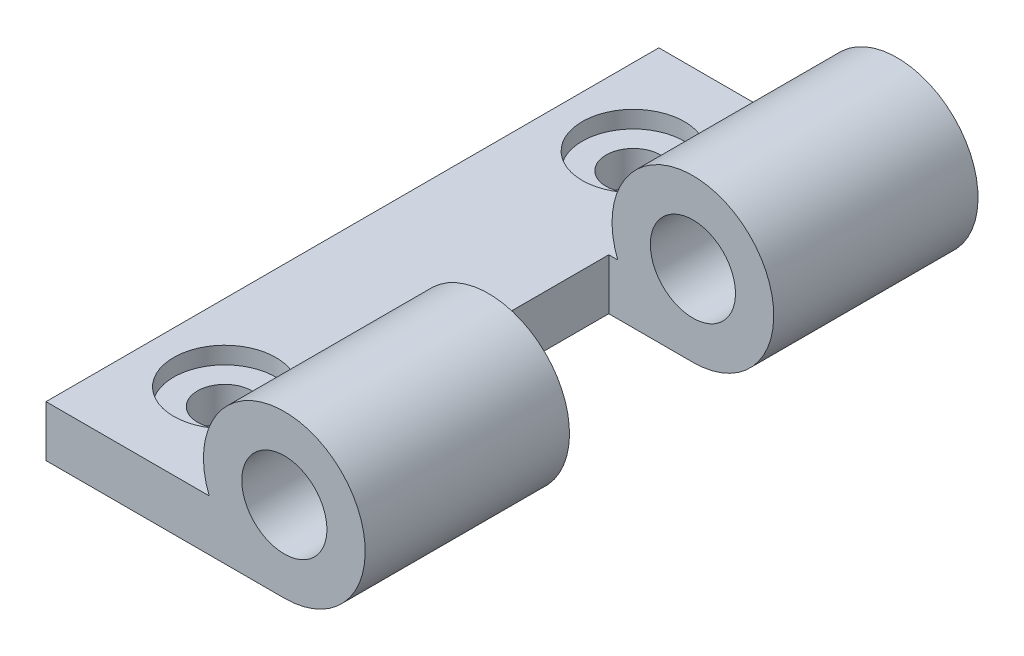
ISO-10303-21;
HEADER;
FILE_DESCRIPTION(('STEP AP214'),'2;1');
FILE_NAME('part.step','',(''),(''),'','','');
FILE_SCHEMA(('AUTOMOTIVE_DESIGN { 1 0 10303 214 1 1 1 1 }'));
ENDSEC;
DATA;
#1=APPLICATION_CONTEXT('core data for automotive mechanical design processes');
#2=APPLICATION_PROTOCOL_DEFINITION('international standard','automotive_design',2000,#1);
#3=PRODUCT_CONTEXT('',#1,'mechanical');
#4=PRODUCT('Part','Part','',(#3));
#5=PRODUCT_RELATED_PRODUCT_CATEGORY('part','',(#4));
#6=PRODUCT_DEFINITION_FORMATION('','',#4);
#7=PRODUCT_DEFINITION_CONTEXT('part definition',#1,'design');
#8=PRODUCT_DEFINITION('design','',#6,#7);
#9=PRODUCT_DEFINITION_SHAPE('','',#8);
#10=(LENGTH_UNIT() NAMED_UNIT(*) SI_UNIT(.MILLI.,.METRE.));
#11=(NAMED_UNIT(*) PLANE_ANGLE_UNIT() SI_UNIT($,.RADIAN.));
#12=(NAMED_UNIT(*) SI_UNIT($,.STERADIAN.) SOLID_ANGLE_UNIT());
#13=UNCERTAINTY_MEASURE_WITH_UNIT(LENGTH_MEASURE(1.E-05),#10,'distance_accuracy_value','');
#14=(GEOMETRIC_REPRESENTATION_CONTEXT(3) GLOBAL_UNCERTAINTY_ASSIGNED_CONTEXT((#13)) GLOBAL_UNIT_ASSIGNED_CONTEXT((#10,
#11,#12)) REPRESENTATION_CONTEXT('',''));
#15=CARTESIAN_POINT('',(0.,0.,0.));
#16=DIRECTION('',(0.,0.,1.));
#17=DIRECTION('',(1.,0.,0.));
#18=AXIS2_PLACEMENT_3D('',#15,#16,#17);
#19=CARTESIAN_POINT('',(4.5,-7.00000000000003,30.));
#20=DIRECTION('',(0.,1.,0.));
#21=DIRECTION('',(0.,0.,1.));
#22=AXIS2_PLACEMENT_3D('',#19,#20,#21);
#23=CYLINDRICAL_SURFACE('',#22,1.6);
#24=CARTESIAN_POINT('',(4.5,0.,30.));
#25=DIRECTION('',(0.,1.,0.));
#26=DIRECTION('',(0.,0.,1.));
#27=AXIS2_PLACEMENT_3D('',#24,#25,#26);
#28=CIRCLE('',#27,1.6);
#29=CARTESIAN_POINT('',(4.5,0.,31.6));
#30=VERTEX_POINT('',#29);
#31=EDGE_CURVE('E188',#30,#30,#28,.T.);
#32=ORIENTED_EDGE('',*,*,#31,.F.);
#33=EDGE_LOOP('',(#32));
#34=FACE_BOUND('',#33,.T.);
#35=CARTESIAN_POINT('',(4.5,2.,30.));
#36=DIRECTION('',(0.,1.,0.));
#37=DIRECTION('',(0.,0.,1.));
#38=AXIS2_PLACEMENT_3D('',#35,#36,#37);
#39=CIRCLE('',#38,1.6);
#40=CARTESIAN_POINT('',(4.5,2.,31.6));
#41=VERTEX_POINT('',#40);
#42=EDGE_CURVE('E50',#41,#41,#39,.F.);
#43=ORIENTED_EDGE('',*,*,#42,.F.);
#44=EDGE_LOOP('',(#43));
#45=FACE_BOUND('',#44,.T.);
#46=ADVANCED_FACE('F46',(#34,#45),#23,.F.);
#47=CARTESIAN_POINT('',(4.5,-7.00000000000003,6.));
#48=DIRECTION('',(0.,1.,0.));
#49=DIRECTION('',(0.,0.,1.));
#50=AXIS2_PLACEMENT_3D('',#47,#48,#49);
#51=CYLINDRICAL_SURFACE('',#50,1.6);
#52=CARTESIAN_POINT('',(4.5,0.,6.));
#53=DIRECTION('',(0.,1.,0.));
#54=DIRECTION('',(0.,0.,1.));
#55=AXIS2_PLACEMENT_3D('',#52,#53,#54);
#56=CIRCLE('',#55,1.6);
#57=CARTESIAN_POINT('',(4.5,0.,7.6));
#58=VERTEX_POINT('',#57);
#59=EDGE_CURVE('E191',#58,#58,#56,.T.);
#60=ORIENTED_EDGE('',*,*,#59,.F.);
#61=EDGE_LOOP('',(#60));
#62=FACE_BOUND('',#61,.T.);
#63=CARTESIAN_POINT('',(4.5,2.,6.));
#64=DIRECTION('',(0.,1.,0.));
#65=DIRECTION('',(0.,0.,1.));
#66=AXIS2_PLACEMENT_3D('',#63,#64,#65);
#67=CIRCLE('',#66,1.6);
#68=CARTESIAN_POINT('',(4.5,2.,7.6));
#69=VERTEX_POINT('',#68);
#70=EDGE_CURVE('E193',#69,#69,#67,.F.);
#71=ORIENTED_EDGE('',*,*,#70,.F.);
#72=EDGE_LOOP('',(#71));
#73=FACE_BOUND('',#72,.T.);
#74=ADVANCED_FACE('F245',(#62,#73),#51,.F.);
#75=CARTESIAN_POINT('',(14.,4.75,51.));
#76=DIRECTION('',(0.,0.,-1.));
#77=DIRECTION('',(-1.,0.,0.));
#78=AXIS2_PLACEMENT_3D('',#75,#76,#77);
#79=CYLINDRICAL_SURFACE('',#78,2.5);
#80=CARTESIAN_POINT('',(14.,4.75,36.));
#81=DIRECTION('',(0.,0.,-1.));
#82=DIRECTION('',(-1.,0.,0.));
#83=AXIS2_PLACEMENT_3D('',#80,#81,#82);
#84=CIRCLE('',#83,2.5);
#85=CARTESIAN_POINT('',(11.5,4.75,36.));
#86=VERTEX_POINT('',#85);
#87=EDGE_CURVE('E149',#86,#86,#84,.T.);
#88=ORIENTED_EDGE('',*,*,#87,.F.);
#89=EDGE_LOOP('',(#88));
#90=FACE_BOUND('',#89,.T.);
#91=CARTESIAN_POINT('',(14.,4.75,24.));
#92=DIRECTION('',(0.,0.,1.));
#93=DIRECTION('',(1.,0.,0.));
#94=AXIS2_PLACEMENT_3D('',#91,#92,#93);
#95=CIRCLE('',#94,2.5);
#96=CARTESIAN_POINT('',(16.5,4.75,24.));
#97=VERTEX_POINT('',#96);
#98=EDGE_CURVE('E55',#97,#97,#95,.T.);
#99=ORIENTED_EDGE('',*,*,#98,.F.);
#100=EDGE_LOOP('',(#99));
#101=FACE_BOUND('',#100,.T.);
#102=ADVANCED_FACE('F251',(#90,#101),#79,.F.);
#103=CARTESIAN_POINT('',(0.,3.,0.));
#104=DIRECTION('',(1.,0.,0.));
#105=DIRECTION('',(0.,0.,-1.));
#106=AXIS2_PLACEMENT_3D('',#103,#104,#105);
#107=PLANE('',#106);
#108=DIRECTION('',(0.,0.,1.));
#109=VECTOR('',#108,1.);
#110=CARTESIAN_POINT('',(0.,0.,0.));
#111=LINE('',#110,#109);
#112=CARTESIAN_POINT('',(0.,0.,0.));
#113=VERTEX_POINT('',#112);
#114=CARTESIAN_POINT('',(0.,0.,36.));
#115=VERTEX_POINT('',#114);
#116=EDGE_CURVE('E165',#113,#115,#111,.T.);
#117=ORIENTED_EDGE('',*,*,#116,.T.);
#118=DIRECTION('',(0.,-1.,0.));
#119=VECTOR('',#118,1.);
#120=CARTESIAN_POINT('',(0.,3.,36.));
#121=LINE('',#120,#119);
#122=CARTESIAN_POINT('',(0.,3.,36.));
#123=VERTEX_POINT('',#122);
#124=EDGE_CURVE('E183',#123,#115,#121,.T.);
#125=ORIENTED_EDGE('',*,*,#124,.F.);
#126=DIRECTION('',(0.,0.,1.));
#127=VECTOR('',#126,1.);
#128=CARTESIAN_POINT('',(0.,3.,0.));
#129=LINE('',#128,#127);
#130=CARTESIAN_POINT('',(0.,3.,0.));
#131=VERTEX_POINT('',#130);
#132=EDGE_CURVE('E166',#131,#123,#129,.T.);
#133=ORIENTED_EDGE('',*,*,#132,.F.);
#134=DIRECTION('',(0.,-1.,0.));
#135=VECTOR('',#134,1.);
#136=CARTESIAN_POINT('',(0.,3.,0.));
#137=LINE('',#136,#135);
#138=EDGE_CURVE('E172',#131,#113,#137,.T.);
#139=ORIENTED_EDGE('',*,*,#138,.T.);
#140=EDGE_LOOP('',(#117,#125,#133,#139));
#141=FACE_BOUND('',#140,.T.);
#142=ADVANCED_FACE('F48',(#141),#107,.F.);
#143=CARTESIAN_POINT('',(0.,3.,36.));
#144=DIRECTION('',(0.,0.,-1.));
#145=DIRECTION('',(-1.,0.,0.));
#146=AXIS2_PLACEMENT_3D('',#143,#144,#145);
#147=PLANE('',#146);
#148=ORIENTED_EDGE('',*,*,#87,.T.);
#149=EDGE_LOOP('',(#148));
#150=FACE_BOUND('',#149,.T.);
#151=DIRECTION('',(1.,0.,0.));
#152=VECTOR('',#151,1.);
#153=CARTESIAN_POINT('',(0.,0.,36.));
#154=LINE('',#153,#152);
#155=CARTESIAN_POINT('',(14.,0.,36.));
#156=VERTEX_POINT('',#155);
#157=EDGE_CURVE('E175',#115,#156,#154,.T.);
#158=ORIENTED_EDGE('',*,*,#157,.T.);
#159=CARTESIAN_POINT('',(14.,4.75,36.));
#160=DIRECTION('',(0.,0.,1.));
#161=DIRECTION('',(1.,0.,0.));
#162=AXIS2_PLACEMENT_3D('',#159,#160,#161);
#163=CIRCLE('',#162,4.75);
#164=CARTESIAN_POINT('',(9.58411956683608,3.,36.));
#165=VERTEX_POINT('',#164);
#166=EDGE_CURVE('E152',#156,#165,#163,.T.);
#167=ORIENTED_EDGE('',*,*,#166,.T.);
#168=DIRECTION('',(1.,0.,0.));
#169=VECTOR('',#168,1.);
#170=CARTESIAN_POINT('',(0.,3.,36.));
#171=LINE('',#170,#169);
#172=EDGE_CURVE('E63',#123,#165,#171,.T.);
#173=ORIENTED_EDGE('',*,*,#172,.F.);
#174=ORIENTED_EDGE('',*,*,#124,.T.);
#175=EDGE_LOOP('',(#158,#167,#173,#174));
#176=FACE_BOUND('',#175,.T.);
#177=ADVANCED_FACE('F222',(#150,#176),#147,.F.);
#178=CARTESIAN_POINT('',(0.,3.,0.));
#179=DIRECTION('',(0.,0.,1.));
#180=DIRECTION('',(1.,0.,0.));
#181=AXIS2_PLACEMENT_3D('',#178,#179,#180);
#182=PLANE('',#181);
#183=CARTESIAN_POINT('',(14.,4.75,0.));
#184=DIRECTION('',(0.,0.,-1.));
#185=DIRECTION('',(-1.,0.,0.));
#186=AXIS2_PLACEMENT_3D('',#183,#184,#185);
#187=CIRCLE('',#186,2.5);
#188=CARTESIAN_POINT('',(11.5,4.75,0.));
#189=VERTEX_POINT('',#188);
#190=EDGE_CURVE('E143',#189,#189,#187,.T.);
#191=ORIENTED_EDGE('',*,*,#190,.F.);
#192=EDGE_LOOP('',(#191));
#193=FACE_BOUND('',#192,.T.);
#194=CARTESIAN_POINT('',(14.,4.75,0.));
#195=DIRECTION('',(0.,0.,-1.));
#196=DIRECTION('',(-1.,0.,0.));
#197=AXIS2_PLACEMENT_3D('',#194,#195,#196);
#198=CIRCLE('',#197,4.75);
#199=CARTESIAN_POINT('',(9.58411956683608,3.,0.));
#200=VERTEX_POINT('',#199);
#201=CARTESIAN_POINT('',(14.,0.,0.));
#202=VERTEX_POINT('',#201);
#203=EDGE_CURVE('E159',#200,#202,#198,.T.);
#204=ORIENTED_EDGE('',*,*,#203,.T.);
#205=DIRECTION('',(-1.,0.,0.));
#206=VECTOR('',#205,1.);
#207=CARTESIAN_POINT('',(0.,0.,0.));
#208=LINE('',#207,#206);
#209=EDGE_CURVE('E168',#202,#113,#208,.T.);
#210=ORIENTED_EDGE('',*,*,#209,.T.);
#211=ORIENTED_EDGE('',*,*,#138,.F.);
#212=DIRECTION('',(-1.,0.,0.));
#213=VECTOR('',#212,1.);
#214=CARTESIAN_POINT('',(0.,3.,0.));
#215=LINE('',#214,#213);
#216=EDGE_CURVE('E170',#200,#131,#215,.T.);
#217=ORIENTED_EDGE('',*,*,#216,.F.);
#218=EDGE_LOOP('',(#204,#210,#211,#217));
#219=FACE_BOUND('',#218,.T.);
#220=ADVANCED_FACE('F230',(#193,#219),#182,.F.);
#221=CARTESIAN_POINT('',(0.,3.,0.));
#222=DIRECTION('',(0.,1.,0.));
#223=DIRECTION('',(0.,0.,1.));
#224=AXIS2_PLACEMENT_3D('',#221,#222,#223);
#225=PLANE('',#224);
#226=CARTESIAN_POINT('',(4.5,3.,6.));
#227=DIRECTION('',(0.,1.,0.));
#228=DIRECTION('',(0.,0.,1.));
#229=AXIS2_PLACEMENT_3D('',#226,#227,#228);
#230=CIRCLE('',#229,3.);
#231=CARTESIAN_POINT('',(4.5,3.,9.));
#232=VERTEX_POINT('',#231);
#233=EDGE_CURVE('E200',#232,#232,#230,.T.);
#234=ORIENTED_EDGE('',*,*,#233,.F.);
#235=EDGE_LOOP('',(#234));
#236=FACE_BOUND('',#235,.T.);
#237=CARTESIAN_POINT('',(4.5,3.,30.));
#238=DIRECTION('',(0.,1.,0.));
#239=DIRECTION('',(0.,0.,1.));
#240=AXIS2_PLACEMENT_3D('',#237,#238,#239);
#241=CIRCLE('',#240,3.);
#242=CARTESIAN_POINT('',(4.5,3.,33.));
#243=VERTEX_POINT('',#242);
#244=EDGE_CURVE('E210',#243,#243,#241,.T.);
#245=ORIENTED_EDGE('',*,*,#244,.F.);
#246=EDGE_LOOP('',(#245));
#247=FACE_BOUND('',#246,.T.);
#248=DIRECTION('',(1.,0.,0.));
#249=VECTOR('',#248,1.);
#250=CARTESIAN_POINT('',(0.,3.,24.));
#251=LINE('',#250,#249);
#252=CARTESIAN_POINT('',(9.0578040025134,3.,24.));
#253=VERTEX_POINT('',#252);
#254=CARTESIAN_POINT('',(9.58411956683608,3.,24.));
#255=VERTEX_POINT('',#254);
#256=EDGE_CURVE('E134',#253,#255,#251,.T.);
#257=ORIENTED_EDGE('',*,*,#256,.F.);
#258=DIRECTION('',(0.,0.,-1.));
#259=VECTOR('',#258,1.);
#260=CARTESIAN_POINT('',(9.0578040025134,3.,0.));
#261=LINE('',#260,#259);
#262=CARTESIAN_POINT('',(9.0578040025134,3.,12.));
#263=VERTEX_POINT('',#262);
#264=EDGE_CURVE('E141',#253,#263,#261,.T.);
#265=ORIENTED_EDGE('',*,*,#264,.T.);
#266=DIRECTION('',(-1.,0.,0.));
#267=VECTOR('',#266,1.);
#268=CARTESIAN_POINT('',(0.,3.,12.));
#269=LINE('',#268,#267);
#270=CARTESIAN_POINT('',(9.58411956683608,3.,12.));
#271=VERTEX_POINT('',#270);
#272=EDGE_CURVE('E128',#271,#263,#269,.T.);
#273=ORIENTED_EDGE('',*,*,#272,.F.);
#274=DIRECTION('',(0.,0.,-1.));
#275=VECTOR('',#274,1.);
#276=CARTESIAN_POINT('',(9.58411956683608,3.,12.));
#277=LINE('',#276,#275);
#278=EDGE_CURVE('E70',#200,#271,#277,.F.);
#279=ORIENTED_EDGE('',*,*,#278,.F.);
#280=ORIENTED_EDGE('',*,*,#216,.T.);
#281=ORIENTED_EDGE('',*,*,#132,.T.);
#282=ORIENTED_EDGE('',*,*,#172,.T.);
#283=DIRECTION('',(0.,0.,1.));
#284=VECTOR('',#283,1.);
#285=CARTESIAN_POINT('',(9.58411956683608,3.,24.));
#286=LINE('',#285,#284);
#287=EDGE_CURVE('E155',#255,#165,#286,.T.);
#288=ORIENTED_EDGE('',*,*,#287,.F.);
#289=EDGE_LOOP('',(#257,#265,#273,#279,#280,#281,#282,#288));
#290=FACE_BOUND('',#289,.T.);
#291=ADVANCED_FACE('F217',(#236,#247,#290),#225,.T.);
#292=CARTESIAN_POINT('',(0.,0.,0.));
#293=DIRECTION('',(0.,1.,0.));
#294=DIRECTION('',(0.,0.,1.));
#295=AXIS2_PLACEMENT_3D('',#292,#293,#294);
#296=PLANE('',#295);
#297=ORIENTED_EDGE('',*,*,#59,.T.);
#298=EDGE_LOOP('',(#297));
#299=FACE_BOUND('',#298,.T.);
#300=ORIENTED_EDGE('',*,*,#31,.T.);
#301=EDGE_LOOP('',(#300));
#302=FACE_BOUND('',#301,.T.);
#303=DIRECTION('',(0.,0.,-1.));
#304=VECTOR('',#303,1.);
#305=CARTESIAN_POINT('',(9.0578040025134,0.,0.));
#306=LINE('',#305,#304);
#307=CARTESIAN_POINT('',(9.0578040025134,0.,24.));
#308=VERTEX_POINT('',#307);
#309=CARTESIAN_POINT('',(9.0578040025134,0.,12.));
#310=VERTEX_POINT('',#309);
#311=EDGE_CURVE('E13',#308,#310,#306,.T.);
#312=ORIENTED_EDGE('',*,*,#311,.F.);
#313=DIRECTION('',(1.,0.,0.));
#314=VECTOR('',#313,1.);
#315=CARTESIAN_POINT('',(0.,0.,24.));
#316=LINE('',#315,#314);
#317=CARTESIAN_POINT('',(14.,0.,24.));
#318=VERTEX_POINT('',#317);
#319=EDGE_CURVE('E139',#308,#318,#316,.T.);
#320=ORIENTED_EDGE('',*,*,#319,.T.);
#321=DIRECTION('',(0.,0.,-1.));
#322=VECTOR('',#321,1.);
#323=CARTESIAN_POINT('',(14.,0.,0.));
#324=LINE('',#323,#322);
#325=EDGE_CURVE('E177',#156,#318,#324,.T.);
#326=ORIENTED_EDGE('',*,*,#325,.F.);
#327=ORIENTED_EDGE('',*,*,#157,.F.);
#328=ORIENTED_EDGE('',*,*,#116,.F.);
#329=ORIENTED_EDGE('',*,*,#209,.F.);
#330=CARTESIAN_POINT('',(14.,0.,12.));
#331=VERTEX_POINT('',#330);
#332=EDGE_CURVE('E132',#331,#202,#324,.T.);
#333=ORIENTED_EDGE('',*,*,#332,.F.);
#334=DIRECTION('',(-1.,0.,0.));
#335=VECTOR('',#334,1.);
#336=CARTESIAN_POINT('',(0.,0.,12.));
#337=LINE('',#336,#335);
#338=EDGE_CURVE('E126',#331,#310,#337,.T.);
#339=ORIENTED_EDGE('',*,*,#338,.T.);
#340=EDGE_LOOP('',(#312,#320,#326,#327,#328,#329,#333,#339));
#341=FACE_BOUND('',#340,.T.);
#342=ADVANCED_FACE('F130',(#299,#302,#341),#296,.F.);
#343=CARTESIAN_POINT('',(14.,4.75,12.));
#344=DIRECTION('',(0.,0.,-1.));
#345=DIRECTION('',(-1.,0.,0.));
#346=AXIS2_PLACEMENT_3D('',#343,#344,#345);
#347=PLANE('',#346);
#348=ORIENTED_EDGE('',*,*,#338,.F.);
#349=CARTESIAN_POINT('',(14.,4.75,12.));
#350=DIRECTION('',(0.,0.,-1.));
#351=DIRECTION('',(-1.,0.,0.));
#352=AXIS2_PLACEMENT_3D('',#349,#350,#351);
#353=CIRCLE('',#352,4.75);
#354=EDGE_CURVE('E160',#271,#331,#353,.T.);
#355=ORIENTED_EDGE('',*,*,#354,.F.);
#356=ORIENTED_EDGE('',*,*,#272,.T.);
#357=DIRECTION('',(0.,1.,0.));
#358=VECTOR('',#357,1.);
#359=CARTESIAN_POINT('',(9.0578040025134,8.00413908272315,12.));
#360=LINE('',#359,#358);
#361=EDGE_CURVE('E115',#310,#263,#360,.T.);
#362=ORIENTED_EDGE('',*,*,#361,.F.);
#363=EDGE_LOOP('',(#348,#355,#356,#362));
#364=FACE_BOUND('',#363,.T.);
#365=CARTESIAN_POINT('',(14.,4.75,12.));
#366=DIRECTION('',(0.,0.,-1.));
#367=DIRECTION('',(-1.,0.,0.));
#368=AXIS2_PLACEMENT_3D('',#365,#366,#367);
#369=CIRCLE('',#368,2.5);
#370=CARTESIAN_POINT('',(11.5,4.75,12.));
#371=VERTEX_POINT('',#370);
#372=EDGE_CURVE('E146',#371,#371,#369,.T.);
#373=ORIENTED_EDGE('',*,*,#372,.T.);
#374=EDGE_LOOP('',(#373));
#375=FACE_BOUND('',#374,.T.);
#376=ADVANCED_FACE('F123',(#364,#375),#347,.F.);
#377=CARTESIAN_POINT('',(14.,4.75,12.));
#378=DIRECTION('',(0.,0.,-1.));
#379=DIRECTION('',(-1.,0.,0.));
#380=AXIS2_PLACEMENT_3D('',#377,#378,#379);
#381=CYLINDRICAL_SURFACE('',#380,4.75);
#382=ORIENTED_EDGE('',*,*,#203,.F.);
#383=ORIENTED_EDGE('',*,*,#278,.T.);
#384=ORIENTED_EDGE('',*,*,#354,.T.);
#385=ORIENTED_EDGE('',*,*,#332,.T.);
#386=EDGE_LOOP('',(#382,#383,#384,#385));
#387=FACE_BOUND('',#386,.T.);
#388=ADVANCED_FACE('F233',(#387),#381,.T.);
#389=CARTESIAN_POINT('',(14.,4.75,24.));
#390=DIRECTION('',(0.,0.,1.));
#391=DIRECTION('',(1.,0.,0.));
#392=AXIS2_PLACEMENT_3D('',#389,#390,#391);
#393=PLANE('',#392);
#394=ORIENTED_EDGE('',*,*,#98,.T.);
#395=EDGE_LOOP('',(#394));
#396=FACE_BOUND('',#395,.T.);
#397=ORIENTED_EDGE('',*,*,#256,.T.);
#398=CARTESIAN_POINT('',(14.,4.75,24.));
#399=DIRECTION('',(0.,0.,1.));
#400=DIRECTION('',(1.,0.,0.));
#401=AXIS2_PLACEMENT_3D('',#398,#399,#400);
#402=CIRCLE('',#401,4.75);
#403=EDGE_CURVE('E153',#318,#255,#402,.T.);
#404=ORIENTED_EDGE('',*,*,#403,.F.);
#405=ORIENTED_EDGE('',*,*,#319,.F.);
#406=DIRECTION('',(0.,1.,0.));
#407=VECTOR('',#406,1.);
#408=CARTESIAN_POINT('',(9.0578040025134,8.00413908272315,24.));
#409=LINE('',#408,#407);
#410=EDGE_CURVE('E118',#308,#253,#409,.T.);
#411=ORIENTED_EDGE('',*,*,#410,.T.);
#412=EDGE_LOOP('',(#397,#404,#405,#411));
#413=FACE_BOUND('',#412,.T.);
#414=ADVANCED_FACE('F215',(#396,#413),#393,.F.);
#415=CARTESIAN_POINT('',(14.,4.75,24.));
#416=DIRECTION('',(0.,0.,1.));
#417=DIRECTION('',(1.,0.,0.));
#418=AXIS2_PLACEMENT_3D('',#415,#416,#417);
#419=CYLINDRICAL_SURFACE('',#418,4.75);
#420=ORIENTED_EDGE('',*,*,#403,.T.);
#421=ORIENTED_EDGE('',*,*,#287,.T.);
#422=ORIENTED_EDGE('',*,*,#166,.F.);
#423=ORIENTED_EDGE('',*,*,#325,.T.);
#424=EDGE_LOOP('',(#420,#421,#422,#423));
#425=FACE_BOUND('',#424,.T.);
#426=ADVANCED_FACE('F220',(#425),#419,.T.);
#427=ORIENTED_EDGE('',*,*,#372,.F.);
#428=EDGE_LOOP('',(#427));
#429=FACE_BOUND('',#428,.T.);
#430=ORIENTED_EDGE('',*,*,#190,.T.);
#431=EDGE_LOOP('',(#430));
#432=FACE_BOUND('',#431,.T.);
#433=ADVANCED_FACE('F261',(#429,#432),#79,.F.);
#434=CARTESIAN_POINT('',(9.0578040025134,8.00413908272315,-1.91141488657414));
#435=DIRECTION('',(1.,0.,0.));
#436=DIRECTION('',(0.,1.,0.));
#437=AXIS2_PLACEMENT_3D('',#434,#435,#436);
#438=PLANE('',#437);
#439=ORIENTED_EDGE('',*,*,#410,.F.);
#440=ORIENTED_EDGE('',*,*,#311,.T.);
#441=ORIENTED_EDGE('',*,*,#361,.T.);
#442=ORIENTED_EDGE('',*,*,#264,.F.);
#443=EDGE_LOOP('',(#439,#440,#441,#442));
#444=FACE_BOUND('',#443,.T.);
#445=ADVANCED_FACE('F114',(#444),#438,.T.);
#446=CARTESIAN_POINT('',(4.5,2.,6.));
#447=DIRECTION('',(0.,1.,0.));
#448=DIRECTION('',(0.,0.,1.));
#449=AXIS2_PLACEMENT_3D('',#446,#447,#448);
#450=PLANE('',#449);
#451=CARTESIAN_POINT('',(4.5,2.,6.));
#452=DIRECTION('',(0.,1.,0.));
#453=DIRECTION('',(0.,0.,1.));
#454=AXIS2_PLACEMENT_3D('',#451,#452,#453);
#455=CIRCLE('',#454,3.);
#456=CARTESIAN_POINT('',(4.5,2.,9.));
#457=VERTEX_POINT('',#456);
#458=EDGE_CURVE('E195',#457,#457,#455,.T.);
#459=ORIENTED_EDGE('',*,*,#458,.T.);
#460=EDGE_LOOP('',(#459));
#461=FACE_BOUND('',#460,.T.);
#462=ORIENTED_EDGE('',*,*,#70,.T.);
#463=EDGE_LOOP('',(#462));
#464=FACE_BOUND('',#463,.T.);
#465=ADVANCED_FACE('F260',(#461,#464),#450,.T.);
#466=CARTESIAN_POINT('',(4.5,2.,6.));
#467=DIRECTION('',(0.,1.,0.));
#468=DIRECTION('',(0.,0.,1.));
#469=AXIS2_PLACEMENT_3D('',#466,#467,#468);
#470=CYLINDRICAL_SURFACE('',#469,3.);
#471=ORIENTED_EDGE('',*,*,#458,.F.);
#472=EDGE_LOOP('',(#471));
#473=FACE_BOUND('',#472,.T.);
#474=ORIENTED_EDGE('',*,*,#233,.T.);
#475=EDGE_LOOP('',(#474));
#476=FACE_BOUND('',#475,.T.);
#477=ADVANCED_FACE('F285',(#473,#476),#470,.F.);
#478=CARTESIAN_POINT('',(4.5,2.,30.));
#479=DIRECTION('',(0.,1.,0.));
#480=DIRECTION('',(0.,0.,1.));
#481=AXIS2_PLACEMENT_3D('',#478,#479,#480);
#482=PLANE('',#481);
#483=CARTESIAN_POINT('',(4.5,2.,30.));
#484=DIRECTION('',(0.,1.,0.));
#485=DIRECTION('',(0.,0.,1.));
#486=AXIS2_PLACEMENT_3D('',#483,#484,#485);
#487=CIRCLE('',#486,3.);
#488=CARTESIAN_POINT('',(4.5,2.,33.));
#489=VERTEX_POINT('',#488);
#490=EDGE_CURVE('E205',#489,#489,#487,.T.);
#491=ORIENTED_EDGE('',*,*,#490,.T.);
#492=EDGE_LOOP('',(#491));
#493=FACE_BOUND('',#492,.T.);
#494=ORIENTED_EDGE('',*,*,#42,.T.);
#495=EDGE_LOOP('',(#494));
#496=FACE_BOUND('',#495,.T.);
#497=ADVANCED_FACE('F293',(#493,#496),#482,.T.);
#498=CARTESIAN_POINT('',(4.5,2.,30.));
#499=DIRECTION('',(0.,1.,0.));
#500=DIRECTION('',(0.,0.,1.));
#501=AXIS2_PLACEMENT_3D('',#498,#499,#500);
#502=CYLINDRICAL_SURFACE('',#501,3.);
#503=ORIENTED_EDGE('',*,*,#490,.F.);
#504=EDGE_LOOP('',(#503));
#505=FACE_BOUND('',#504,.T.);
#506=ORIENTED_EDGE('',*,*,#244,.T.);
#507=EDGE_LOOP('',(#506));
#508=FACE_BOUND('',#507,.T.);
#509=ADVANCED_FACE('F301',(#505,#508),#502,.F.);
#510=CLOSED_SHELL('',(#46,#74,#102,#142,#177,#220,#291,#342,#376,#388,#414,#426,#433,#445,#465,
#477,#497,#509));
#511=MANIFOLD_SOLID_BREP('B2',#510);
#512=ADVANCED_BREP_SHAPE_REPRESENTATION('',(#18,#511),#14);
#513=SHAPE_DEFINITION_REPRESENTATION(#9,#512);
ENDSEC;
END-ISO-10303-21;
